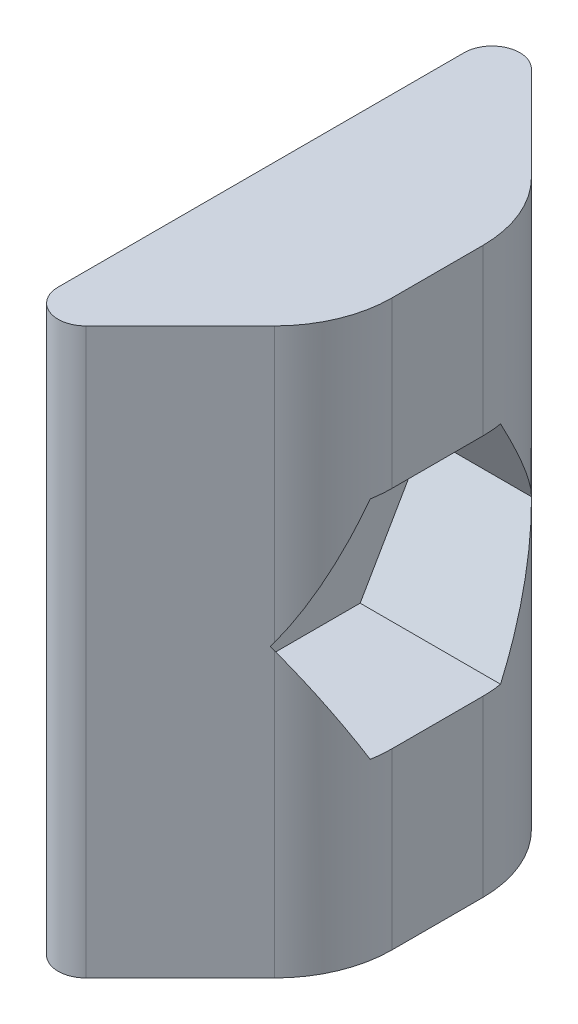
ISO-10303-21;
HEADER;
FILE_DESCRIPTION(('STEP AP214'),'2;1');
FILE_NAME('part.step','',(''),(''),'','','');
FILE_SCHEMA(('AUTOMOTIVE_DESIGN { 1 0 10303 214 1 1 1 1 }'));
ENDSEC;
DATA;
#1=APPLICATION_CONTEXT('core data for automotive mechanical design processes');
#2=APPLICATION_PROTOCOL_DEFINITION('international standard','automotive_design',2000,#1);
#3=PRODUCT_CONTEXT('',#1,'mechanical');
#4=PRODUCT('Part','Part','',(#3));
#5=PRODUCT_RELATED_PRODUCT_CATEGORY('part','',(#4));
#6=PRODUCT_DEFINITION_FORMATION('','',#4);
#7=PRODUCT_DEFINITION_CONTEXT('part definition',#1,'design');
#8=PRODUCT_DEFINITION('design','',#6,#7);
#9=PRODUCT_DEFINITION_SHAPE('','',#8);
#10=(LENGTH_UNIT() NAMED_UNIT(*) SI_UNIT(.MILLI.,.METRE.));
#11=(NAMED_UNIT(*) PLANE_ANGLE_UNIT() SI_UNIT($,.RADIAN.));
#12=(NAMED_UNIT(*) SI_UNIT($,.STERADIAN.) SOLID_ANGLE_UNIT());
#13=UNCERTAINTY_MEASURE_WITH_UNIT(LENGTH_MEASURE(1.E-05),#10,'distance_accuracy_value','');
#14=(GEOMETRIC_REPRESENTATION_CONTEXT(3) GLOBAL_UNCERTAINTY_ASSIGNED_CONTEXT((#13)) GLOBAL_UNIT_ASSIGNED_CONTEXT((#10,
#11,#12)) REPRESENTATION_CONTEXT('',''));
#15=CARTESIAN_POINT('',(0.,0.,0.));
#16=DIRECTION('',(0.,0.,1.));
#17=DIRECTION('',(1.,0.,0.));
#18=AXIS2_PLACEMENT_3D('',#15,#16,#17);
#19=CARTESIAN_POINT('',(634.903700866565,896.968143730619,1268.23178278987));
#20=DIRECTION('',(0.,-1.,0.));
#21=DIRECTION('',(1.,0.,0.));
#22=AXIS2_PLACEMENT_3D('',#19,#20,#21);
#23=CYLINDRICAL_SURFACE('',#22,2.91000000000477);
#24=CARTESIAN_POINT('',(634.903700866565,893.741114005556,1268.23178278987));
#25=DIRECTION('',(0.,0.499999999999795,0.866025403784557));
#26=DIRECTION('',(0.,-0.866025403784557,0.499999999999795));
#27=AXIS2_PLACEMENT_3D('',#24,#25,#26);
#28=ELLIPSE('',#27,5.82000000001192,2.91000000000477);
#29=CARTESIAN_POINT('',(636.961381599821,890.177106429798,1270.28946352312));
#30=VERTEX_POINT('',#29);
#31=CARTESIAN_POINT('',(637.770730822498,892.87814373062,1268.7300189104));
#32=VERTEX_POINT('',#31);
#33=EDGE_CURVE('E11',#30,#32,#28,.T.);
#34=ORIENTED_EDGE('',*,*,#33,.T.);
#35=CARTESIAN_POINT('',(634.903700866565,892.87814373062,1268.23178278987));
#36=DIRECTION('',(0.,1.,0.));
#37=DIRECTION('',(-1.,0.,0.));
#38=AXIS2_PLACEMENT_3D('',#35,#36,#37);
#39=CIRCLE('',#38,2.91000000000477);
#40=CARTESIAN_POINT('',(637.813700866569,892.87814373062,1268.23178278381));
#41=VERTEX_POINT('',#40);
#42=EDGE_CURVE('E247',#32,#41,#39,.T.);
#43=ORIENTED_EDGE('',*,*,#42,.T.);
#44=DIRECTION('',(0.,-1.,0.));
#45=VECTOR('',#44,1.);
#46=CARTESIAN_POINT('',(637.813700866569,896.968143730619,1268.23178278381));
#47=LINE('',#46,#45);
#48=CARTESIAN_POINT('',(637.813700866569,896.968143730619,1268.23178278381));
#49=VERTEX_POINT('',#48);
#50=EDGE_CURVE('E188',#49,#41,#47,.T.);
#51=ORIENTED_EDGE('',*,*,#50,.F.);
#52=CARTESIAN_POINT('',(634.903700866565,896.968143730619,1268.23178278987));
#53=DIRECTION('',(0.,1.,0.));
#54=DIRECTION('',(-1.,0.,0.));
#55=AXIS2_PLACEMENT_3D('',#52,#53,#54);
#56=CIRCLE('',#55,2.91000000000477);
#57=CARTESIAN_POINT('',(636.961381599821,896.968143730619,1270.28946352312));
#58=VERTEX_POINT('',#57);
#59=EDGE_CURVE('E259',#58,#49,#56,.T.);
#60=ORIENTED_EDGE('',*,*,#59,.F.);
#61=DIRECTION('',(0.,-1.,0.));
#62=VECTOR('',#61,1.);
#63=CARTESIAN_POINT('',(636.961381599821,896.968143730619,1270.28946352312));
#64=LINE('',#63,#62);
#65=EDGE_CURVE('E192',#58,#30,#64,.T.);
#66=ORIENTED_EDGE('',*,*,#65,.T.);
#67=EDGE_LOOP('',(#34,#43,#51,#60,#66));
#68=FACE_BOUND('',#67,.T.);
#69=ADVANCED_FACE('F39',(#68),#23,.T.);
#70=CARTESIAN_POINT('',(637.813700866569,896.968143730619,1268.23178278381));
#71=DIRECTION('',(-1.,0.,2.10070883581663E-09));
#72=DIRECTION('',(2.10070883581663E-09,0.,1.));
#73=AXIS2_PLACEMENT_3D('',#70,#71,#72);
#74=PLANE('',#73);
#75=DIRECTION('',(0.,-1.,0.));
#76=VECTOR('',#75,1.);
#77=CARTESIAN_POINT('',(637.813700861845,896.968143730619,1265.98264856524));
#78=LINE('',#77,#76);
#79=CARTESIAN_POINT('',(637.813700861845,887.288143730619,1265.98264857135));
#80=VERTEX_POINT('',#79);
#81=CARTESIAN_POINT('',(637.813700861845,882.968143730619,1265.98264856524));
#82=VERTEX_POINT('',#81);
#83=EDGE_CURVE('E183',#80,#82,#78,.T.);
#84=ORIENTED_EDGE('',*,*,#83,.F.);
#85=DIRECTION('',(2.10070883581663E-09,0.,1.));
#86=VECTOR('',#85,1.);
#87=CARTESIAN_POINT('',(637.813700866569,887.288143730619,1268.23178278381));
#88=LINE('',#87,#86);
#89=CARTESIAN_POINT('',(637.813700866569,887.288143730619,1268.23178278381));
#90=VERTEX_POINT('',#89);
#91=EDGE_CURVE('E244',#80,#90,#88,.T.);
#92=ORIENTED_EDGE('',*,*,#91,.T.);
#93=CARTESIAN_POINT('',(637.813700866569,882.968143730619,1268.23178278381));
#94=VERTEX_POINT('',#93);
#95=EDGE_CURVE('E187',#90,#94,#47,.T.);
#96=ORIENTED_EDGE('',*,*,#95,.T.);
#97=DIRECTION('',(-2.10070883581663E-09,0.,-1.));
#98=VECTOR('',#97,1.);
#99=CARTESIAN_POINT('',(637.813700866569,882.968143730619,1268.23178278381));
#100=LINE('',#99,#98);
#101=EDGE_CURVE('E157',#94,#82,#100,.T.);
#102=ORIENTED_EDGE('',*,*,#101,.T.);
#103=EDGE_LOOP('',(#84,#92,#96,#102));
#104=FACE_BOUND('',#103,.T.);
#105=ADVANCED_FACE('F242',(#104),#74,.F.);
#106=CARTESIAN_POINT('',(634.903700861859,896.968143730619,1265.98264857135));
#107=DIRECTION('',(0.,-1.,0.));
#108=DIRECTION('',(1.,0.,0.));
#109=AXIS2_PLACEMENT_3D('',#106,#107,#108);
#110=CYLINDRICAL_SURFACE('',#109,2.90999999998545);
#111=CARTESIAN_POINT('',(634.903700861859,886.45672874507,1265.98264857135));
#112=DIRECTION('',(0.,-0.499999999999773,-0.86602540378457));
#113=DIRECTION('',(0.,-0.86602540378457,0.499999999999773));
#114=AXIS2_PLACEMENT_3D('',#111,#112,#113);
#115=ELLIPSE('',#114,5.81999999997354,2.90999999998545);
#116=CARTESIAN_POINT('',(636.961381595102,890.020736320804,1263.92496783811));
#117=VERTEX_POINT('',#116);
#118=CARTESIAN_POINT('',(637.773837276826,887.288143730619,1265.50263090563));
#119=VERTEX_POINT('',#118);
#120=EDGE_CURVE('E342',#117,#119,#115,.T.);
#121=ORIENTED_EDGE('',*,*,#120,.T.);
#122=CARTESIAN_POINT('',(634.903700861859,887.288143730619,1265.98264857135));
#123=DIRECTION('',(0.,-1.,0.));
#124=DIRECTION('',(1.,0.,0.));
#125=AXIS2_PLACEMENT_3D('',#122,#123,#124);
#126=CIRCLE('',#125,2.90999999998545);
#127=EDGE_CURVE('E206',#119,#80,#126,.T.);
#128=ORIENTED_EDGE('',*,*,#127,.T.);
#129=ORIENTED_EDGE('',*,*,#83,.T.);
#130=CARTESIAN_POINT('',(634.903700861859,882.968143730619,1265.98264857135));
#131=DIRECTION('',(0.,1.,0.));
#132=DIRECTION('',(-1.,0.,0.));
#133=AXIS2_PLACEMENT_3D('',#130,#131,#132);
#134=CIRCLE('',#133,2.90999999998545);
#135=CARTESIAN_POINT('',(636.961381595102,882.968143730619,1263.92496783811));
#136=VERTEX_POINT('',#135);
#137=EDGE_CURVE('E160',#82,#136,#134,.T.);
#138=ORIENTED_EDGE('',*,*,#137,.T.);
#139=DIRECTION('',(0.,-1.,0.));
#140=VECTOR('',#139,1.);
#141=CARTESIAN_POINT('',(636.961381595102,896.968143730619,1263.92496783811));
#142=LINE('',#141,#140);
#143=EDGE_CURVE('E179',#117,#136,#142,.T.);
#144=ORIENTED_EDGE('',*,*,#143,.F.);
#145=EDGE_LOOP('',(#121,#128,#129,#138,#144));
#146=FACE_BOUND('',#145,.T.);
#147=ADVANCED_FACE('F347',(#146),#110,.T.);
#148=CARTESIAN_POINT('',(634.133700891333,896.968143730619,1272.14133687358));
#149=DIRECTION('',(0.,-1.,0.));
#150=DIRECTION('',(1.,0.,0.));
#151=AXIS2_PLACEMENT_3D('',#148,#149,#150);
#152=CYLINDRICAL_SURFACE('',#151,0.689999999997262);
#153=CARTESIAN_POINT('',(634.133700891333,882.968143730619,1272.14133687358));
#154=DIRECTION('',(0.,1.,0.));
#155=DIRECTION('',(-1.,0.,0.));
#156=AXIS2_PLACEMENT_3D('',#153,#154,#155);
#157=CIRCLE('',#156,0.689999999997262);
#158=CARTESIAN_POINT('',(633.443700891336,882.968143730619,1272.14133712409));
#159=VERTEX_POINT('',#158);
#160=CARTESIAN_POINT('',(634.62160457035,882.968143730619,1272.62924055259));
#161=VERTEX_POINT('',#160);
#162=EDGE_CURVE('E147',#159,#161,#157,.T.);
#163=ORIENTED_EDGE('',*,*,#162,.T.);
#164=DIRECTION('',(0.,-1.,0.));
#165=VECTOR('',#164,1.);
#166=CARTESIAN_POINT('',(634.62160457035,896.968143730619,1272.62924055259));
#167=LINE('',#166,#165);
#168=CARTESIAN_POINT('',(634.62160457035,896.968143730619,1272.62924055259));
#169=VERTEX_POINT('',#168);
#170=EDGE_CURVE('E195',#169,#161,#167,.T.);
#171=ORIENTED_EDGE('',*,*,#170,.F.);
#172=CARTESIAN_POINT('',(634.133700891333,896.968143730619,1272.14133687358));
#173=DIRECTION('',(0.,1.,0.));
#174=DIRECTION('',(-1.,0.,0.));
#175=AXIS2_PLACEMENT_3D('',#172,#173,#174);
#176=CIRCLE('',#175,0.689999999997262);
#177=CARTESIAN_POINT('',(633.443700891336,896.968143730619,1272.14133712409));
#178=VERTEX_POINT('',#177);
#179=EDGE_CURVE('E172',#178,#169,#176,.T.);
#180=ORIENTED_EDGE('',*,*,#179,.F.);
#181=DIRECTION('',(0.,-1.,0.));
#182=VECTOR('',#181,1.);
#183=CARTESIAN_POINT('',(633.443700891336,896.968143730619,1272.14133712409));
#184=LINE('',#183,#182);
#185=EDGE_CURVE('E143',#178,#159,#184,.T.);
#186=ORIENTED_EDGE('',*,*,#185,.T.);
#187=EDGE_LOOP('',(#163,#171,#180,#186));
#188=FACE_BOUND('',#187,.T.);
#189=ADVANCED_FACE('F41',(#188),#152,.T.);
#190=CARTESIAN_POINT('',(634.62160457035,896.968143730619,1272.62924055259));
#191=DIRECTION('',(-0.707106781186564,0.,-0.707106781186531));
#192=DIRECTION('',(-0.707106781186531,0.,0.707106781186564));
#193=AXIS2_PLACEMENT_3D('',#190,#191,#192);
#194=PLANE('',#193);
#195=DIRECTION('',(-0.447213595502763,0.774596669238232,0.447213595502784));
#196=VECTOR('',#195,1.);
#197=CARTESIAN_POINT('',(633.607887192195,895.797603728286,1273.64295793075));
#198=LINE('',#197,#196);
#199=CARTESIAN_POINT('',(636.961381599821,889.98918103144,1270.28946352312));
#200=VERTEX_POINT('',#199);
#201=CARTESIAN_POINT('',(636.907132210156,890.083143730619,1270.34371291279));
#202=VERTEX_POINT('',#201);
#203=EDGE_CURVE('E228',#200,#202,#198,.T.);
#204=ORIENTED_EDGE('',*,*,#203,.T.);
#205=DIRECTION('',(0.447213595499794,0.77459666924166,-0.447213595499815));
#206=VECTOR('',#205,1.);
#207=CARTESIAN_POINT('',(638.377955116257,892.630683732923,1268.87289000669));
#208=LINE('',#207,#206);
#209=EDGE_CURVE('E151',#202,#30,#208,.T.);
#210=ORIENTED_EDGE('',*,*,#209,.T.);
#211=ORIENTED_EDGE('',*,*,#65,.F.);
#212=DIRECTION('',(0.707106781186531,0.,-0.707106781186564));
#213=VECTOR('',#212,1.);
#214=CARTESIAN_POINT('',(634.62160457035,896.968143730619,1272.62924055259));
#215=LINE('',#214,#213);
#216=EDGE_CURVE('E111',#169,#58,#215,.T.);
#217=ORIENTED_EDGE('',*,*,#216,.F.);
#218=ORIENTED_EDGE('',*,*,#170,.T.);
#219=DIRECTION('',(0.707106781186531,0.,-0.707106781186564));
#220=VECTOR('',#219,1.);
#221=CARTESIAN_POINT('',(634.62160457035,882.968143730619,1272.62924055259));
#222=LINE('',#221,#220);
#223=CARTESIAN_POINT('',(636.961381599821,882.968143730619,1270.28946352312));
#224=VERTEX_POINT('',#223);
#225=EDGE_CURVE('E150',#161,#224,#222,.T.);
#226=ORIENTED_EDGE('',*,*,#225,.T.);
#227=EDGE_CURVE('E191',#200,#224,#64,.T.);
#228=ORIENTED_EDGE('',*,*,#227,.F.);
#229=EDGE_LOOP('',(#204,#210,#211,#217,#218,#226,#228));
#230=FACE_BOUND('',#229,.T.);
#231=ADVANCED_FACE('F226',(#230),#194,.F.);
#232=ORIENTED_EDGE('',*,*,#95,.F.);
#233=CARTESIAN_POINT('',(634.903700866565,887.288143730619,1268.23178278987));
#234=DIRECTION('',(0.,-1.,0.));
#235=DIRECTION('',(1.,0.,0.));
#236=AXIS2_PLACEMENT_3D('',#233,#234,#235);
#237=CIRCLE('',#236,2.91000000000477);
#238=CARTESIAN_POINT('',(637.7707308225,887.288143730619,1268.73001891041));
#239=VERTEX_POINT('',#238);
#240=EDGE_CURVE('E219',#90,#239,#237,.T.);
#241=ORIENTED_EDGE('',*,*,#240,.T.);
#242=CARTESIAN_POINT('',(634.903700866565,886.425173455722,1268.23178278987));
#243=DIRECTION('',(0.,-0.500000000003944,0.866025403782162));
#244=DIRECTION('',(0.,-0.866025403782162,-0.500000000003944));
#245=AXIS2_PLACEMENT_3D('',#242,#243,#244);
#246=ELLIPSE('',#245,5.81999999996363,2.91000000000477);
#247=EDGE_CURVE('E48',#239,#200,#246,.T.);
#248=ORIENTED_EDGE('',*,*,#247,.T.);
#249=ORIENTED_EDGE('',*,*,#227,.T.);
#250=CARTESIAN_POINT('',(634.903700866565,882.968143730619,1268.23178278987));
#251=DIRECTION('',(0.,1.,0.));
#252=DIRECTION('',(-1.,0.,0.));
#253=AXIS2_PLACEMENT_3D('',#250,#251,#252);
#254=CIRCLE('',#253,2.91000000000477);
#255=EDGE_CURVE('E154',#224,#94,#254,.T.);
#256=ORIENTED_EDGE('',*,*,#255,.T.);
#257=EDGE_LOOP('',(#232,#241,#248,#249,#256));
#258=FACE_BOUND('',#257,.T.);
#259=ADVANCED_FACE('F216',(#258),#23,.T.);
#260=ORIENTED_EDGE('',*,*,#50,.T.);
#261=DIRECTION('',(-2.10070883581663E-09,0.,-1.));
#262=VECTOR('',#261,1.);
#263=CARTESIAN_POINT('',(637.813700866569,892.87814373062,1268.23178278381));
#264=LINE('',#263,#262);
#265=CARTESIAN_POINT('',(637.813700861845,892.87814373062,1265.98264856524));
#266=VERTEX_POINT('',#265);
#267=EDGE_CURVE('E251',#41,#266,#264,.T.);
#268=ORIENTED_EDGE('',*,*,#267,.T.);
#269=CARTESIAN_POINT('',(637.813700861845,896.968143730619,1265.98264856524));
#270=VERTEX_POINT('',#269);
#271=EDGE_CURVE('E184',#270,#266,#78,.T.);
#272=ORIENTED_EDGE('',*,*,#271,.F.);
#273=DIRECTION('',(-2.10070883581663E-09,0.,-1.));
#274=VECTOR('',#273,1.);
#275=CARTESIAN_POINT('',(637.813700866569,896.968143730619,1268.23178278381));
#276=LINE('',#275,#274);
#277=EDGE_CURVE('E261',#49,#270,#276,.T.);
#278=ORIENTED_EDGE('',*,*,#277,.F.);
#279=EDGE_LOOP('',(#260,#268,#272,#278));
#280=FACE_BOUND('',#279,.T.);
#281=ADVANCED_FACE('F290',(#280),#74,.F.);
#282=CARTESIAN_POINT('',(634.903700861859,892.87814373062,1265.98264857135));
#283=DIRECTION('',(0.,1.,0.));
#284=DIRECTION('',(-1.,0.,0.));
#285=AXIS2_PLACEMENT_3D('',#282,#283,#284);
#286=CIRCLE('',#285,2.90999999998545);
#287=CARTESIAN_POINT('',(637.773837276827,892.87814373062,1265.50263090564));
#288=VERTEX_POINT('',#287);
#289=EDGE_CURVE('E203',#266,#288,#286,.T.);
#290=ORIENTED_EDGE('',*,*,#289,.T.);
#291=CARTESIAN_POINT('',(634.903700861859,893.709558716202,1265.98264857135));
#292=DIRECTION('',(0.,0.499999999996476,-0.866025403786473));
#293=DIRECTION('',(0.,-0.866025403786473,-0.499999999996476));
#294=AXIS2_PLACEMENT_3D('',#291,#292,#293);
#295=ELLIPSE('',#294,5.82000000001192,2.90999999998545);
#296=CARTESIAN_POINT('',(636.961381595102,890.145551140437,1263.92496783811));
#297=VERTEX_POINT('',#296);
#298=EDGE_CURVE('E298',#288,#297,#295,.T.);
#299=ORIENTED_EDGE('',*,*,#298,.T.);
#300=CARTESIAN_POINT('',(636.961381595102,896.968143730619,1263.92496783811));
#301=VERTEX_POINT('',#300);
#302=EDGE_CURVE('E180',#301,#297,#142,.T.);
#303=ORIENTED_EDGE('',*,*,#302,.F.);
#304=CARTESIAN_POINT('',(634.903700861859,896.968143730619,1265.98264857135));
#305=DIRECTION('',(0.,1.,0.));
#306=DIRECTION('',(-1.,0.,0.));
#307=AXIS2_PLACEMENT_3D('',#304,#305,#306);
#308=CIRCLE('',#307,2.90999999998545);
#309=EDGE_CURVE('E263',#270,#301,#308,.T.);
#310=ORIENTED_EDGE('',*,*,#309,.F.);
#311=ORIENTED_EDGE('',*,*,#271,.T.);
#312=EDGE_LOOP('',(#290,#299,#303,#310,#311));
#313=FACE_BOUND('',#312,.T.);
#314=ADVANCED_FACE('F294',(#313),#110,.T.);
#315=CARTESIAN_POINT('',(636.961381595102,896.968143730619,1263.92496783811));
#316=DIRECTION('',(-0.707106781186531,0.,0.707106781186564));
#317=DIRECTION('',(0.707106781186564,0.,0.707106781186531));
#318=AXIS2_PLACEMENT_3D('',#315,#316,#317);
#319=PLANE('',#318);
#320=DIRECTION('',(-0.447213595497453,-0.774596669244388,-0.447213595497432));
#321=VECTOR('',#320,1.);
#322=CARTESIAN_POINT('',(639.324796996205,894.239106694577,1266.28838323921));
#323=LINE('',#322,#321);
#324=CARTESIAN_POINT('',(636.925350660245,890.08314373062,1263.88893690325));
#325=VERTEX_POINT('',#324);
#326=EDGE_CURVE('E197',#297,#325,#323,.T.);
#327=ORIENTED_EDGE('',*,*,#326,.T.);
#328=DIRECTION('',(0.447213595499813,-0.774596669241663,0.447213595499791));
#329=VECTOR('',#328,1.);
#330=CARTESIAN_POINT('',(634.554729072166,894.189180766695,1261.51831531517));
#331=LINE('',#330,#329);
#332=EDGE_CURVE('E200',#325,#117,#331,.T.);
#333=ORIENTED_EDGE('',*,*,#332,.T.);
#334=ORIENTED_EDGE('',*,*,#143,.T.);
#335=DIRECTION('',(-0.707106781186564,0.,-0.707106781186531));
#336=VECTOR('',#335,1.);
#337=CARTESIAN_POINT('',(636.961381595102,882.968143730619,1263.92496783811));
#338=LINE('',#337,#336);
#339=CARTESIAN_POINT('',(634.621604564309,882.968143730619,1261.58519080731));
#340=VERTEX_POINT('',#339);
#341=EDGE_CURVE('E163',#136,#340,#338,.T.);
#342=ORIENTED_EDGE('',*,*,#341,.T.);
#343=DIRECTION('',(0.,-1.,0.));
#344=VECTOR('',#343,1.);
#345=CARTESIAN_POINT('',(634.621604564309,896.968143730619,1261.58519080731));
#346=LINE('',#345,#344);
#347=CARTESIAN_POINT('',(634.621604564309,896.968143730619,1261.58519080731));
#348=VERTEX_POINT('',#347);
#349=EDGE_CURVE('E176',#348,#340,#346,.T.);
#350=ORIENTED_EDGE('',*,*,#349,.F.);
#351=DIRECTION('',(-0.707106781186564,0.,-0.707106781186531));
#352=VECTOR('',#351,1.);
#353=CARTESIAN_POINT('',(636.961381595102,896.968143730619,1263.92496783811));
#354=LINE('',#353,#352);
#355=EDGE_CURVE('E265',#301,#348,#354,.T.);
#356=ORIENTED_EDGE('',*,*,#355,.F.);
#357=ORIENTED_EDGE('',*,*,#302,.T.);
#358=EDGE_LOOP('',(#327,#333,#334,#342,#350,#356,#357));
#359=FACE_BOUND('',#358,.T.);
#360=ADVANCED_FACE('F271',(#359),#319,.F.);
#361=CARTESIAN_POINT('',(634.13370088529,896.968143730619,1262.07309448633));
#362=DIRECTION('',(0.,-1.,0.));
#363=DIRECTION('',(1.,0.,0.));
#364=AXIS2_PLACEMENT_3D('',#361,#362,#363);
#365=CYLINDRICAL_SURFACE('',#364,0.689999999999811);
#366=CARTESIAN_POINT('',(634.13370088529,882.968143730619,1262.07309448633));
#367=DIRECTION('',(0.,1.,0.));
#368=DIRECTION('',(-1.,0.,0.));
#369=AXIS2_PLACEMENT_3D('',#366,#367,#368);
#370=CIRCLE('',#369,0.689999999999811);
#371=CARTESIAN_POINT('',(633.44370088529,882.968143730619,1262.07309423774));
#372=VERTEX_POINT('',#371);
#373=EDGE_CURVE('E165',#340,#372,#370,.T.);
#374=ORIENTED_EDGE('',*,*,#373,.T.);
#375=DIRECTION('',(0.,-1.,0.));
#376=VECTOR('',#375,1.);
#377=CARTESIAN_POINT('',(633.44370088529,896.968143730619,1262.07309423774));
#378=LINE('',#377,#376);
#379=CARTESIAN_POINT('',(633.44370088529,896.968143730619,1262.07309423774));
#380=VERTEX_POINT('',#379);
#381=EDGE_CURVE('E174',#380,#372,#378,.T.);
#382=ORIENTED_EDGE('',*,*,#381,.F.);
#383=CARTESIAN_POINT('',(634.13370088529,896.968143730619,1262.07309448633));
#384=DIRECTION('',(0.,1.,0.));
#385=DIRECTION('',(-1.,0.,0.));
#386=AXIS2_PLACEMENT_3D('',#383,#384,#385);
#387=CIRCLE('',#386,0.689999999999811);
#388=EDGE_CURVE('E137',#348,#380,#387,.T.);
#389=ORIENTED_EDGE('',*,*,#388,.F.);
#390=ORIENTED_EDGE('',*,*,#349,.T.);
#391=EDGE_LOOP('',(#374,#382,#389,#390));
#392=FACE_BOUND('',#391,.T.);
#393=ADVANCED_FACE('F275',(#392),#365,.T.);
#394=CARTESIAN_POINT('',(633.443700103782,896.968143730619,1269.97221554137));
#395=DIRECTION('',(0.999999999999934,0.,-3.63074991381097E-07));
#396=DIRECTION('',(-3.63074991381097E-07,0.,-0.999999999999934));
#397=AXIS2_PLACEMENT_3D('',#394,#395,#396);
#398=PLANE('',#397);
#399=CARTESIAN_POINT('',(633.44369906688,890.083143730619,1267.11632491623));
#400=DIRECTION('',(0.999999999999934,0.,-3.63074991381097E-07));
#401=DIRECTION('',(-3.63074991381097E-07,0.,-0.999999999999934));
#402=AXIS2_PLACEMENT_3D('',#399,#400,#401);
#403=CIRCLE('',#402,1.74999999999986);
#404=CARTESIAN_POINT('',(633.443698431499,890.083143730619,1265.36632491623));
#405=VERTEX_POINT('',#404);
#406=EDGE_CURVE('E383',#405,#405,#403,.T.);
#407=ORIENTED_EDGE('',*,*,#406,.T.);
#408=EDGE_LOOP('',(#407));
#409=FACE_BOUND('',#408,.T.);
#410=DIRECTION('',(3.63074991381097E-07,0.,0.999999999999934));
#411=VECTOR('',#410,1.);
#412=CARTESIAN_POINT('',(633.443700103782,882.968143730619,1269.97221554137));
#413=LINE('',#412,#411);
#414=CARTESIAN_POINT('',(633.443700103782,882.968143730619,1269.97221554137));
#415=VERTEX_POINT('',#414);
#416=EDGE_CURVE('E102',#415,#159,#413,.T.);
#417=ORIENTED_EDGE('',*,*,#416,.T.);
#418=ORIENTED_EDGE('',*,*,#185,.F.);
#419=DIRECTION('',(3.63074991381097E-07,0.,0.999999999999934));
#420=VECTOR('',#419,1.);
#421=CARTESIAN_POINT('',(633.443700103782,896.968143730619,1269.97221554137));
#422=LINE('',#421,#420);
#423=CARTESIAN_POINT('',(633.443700103782,896.968143730619,1269.97221554137));
#424=VERTEX_POINT('',#423);
#425=EDGE_CURVE('E64',#424,#178,#422,.T.);
#426=ORIENTED_EDGE('',*,*,#425,.F.);
#427=DIRECTION('',(6.58771111619776E-13,0.,1.));
#428=VECTOR('',#427,1.);
#429=CARTESIAN_POINT('',(633.443700103782,896.968143730619,1269.97221554137));
#430=LINE('',#429,#428);
#431=CARTESIAN_POINT('',(633.443700103779,896.968143730619,1264.24221582349));
#432=VERTEX_POINT('',#431);
#433=EDGE_CURVE('E135',#432,#424,#430,.T.);
#434=ORIENTED_EDGE('',*,*,#433,.F.);
#435=DIRECTION('',(-3.60289505825203E-07,0.,0.999999999999935));
#436=VECTOR('',#435,1.);
#437=CARTESIAN_POINT('',(633.44370088529,896.968143730619,1262.07309423774));
#438=LINE('',#437,#436);
#439=EDGE_CURVE('E132',#380,#432,#438,.T.);
#440=ORIENTED_EDGE('',*,*,#439,.F.);
#441=ORIENTED_EDGE('',*,*,#381,.T.);
#442=DIRECTION('',(-3.60289505825203E-07,0.,0.999999999999935));
#443=VECTOR('',#442,1.);
#444=CARTESIAN_POINT('',(633.44370088529,882.968143730619,1262.07309423774));
#445=LINE('',#444,#443);
#446=CARTESIAN_POINT('',(633.443700103779,882.968143730619,1264.24221582349));
#447=VERTEX_POINT('',#446);
#448=EDGE_CURVE('E167',#372,#447,#445,.T.);
#449=ORIENTED_EDGE('',*,*,#448,.T.);
#450=DIRECTION('',(6.58771111619776E-13,0.,1.));
#451=VECTOR('',#450,1.);
#452=CARTESIAN_POINT('',(633.443700103782,882.968143730619,1269.97221554137));
#453=LINE('',#452,#451);
#454=EDGE_CURVE('E169',#447,#415,#453,.T.);
#455=ORIENTED_EDGE('',*,*,#454,.T.);
#456=EDGE_LOOP('',(#417,#418,#426,#434,#440,#441,#449,#455));
#457=FACE_BOUND('',#456,.T.);
#458=ADVANCED_FACE('F141',(#409,#457),#398,.F.);
#459=CARTESIAN_POINT('',(634.133700891333,896.968143730619,1272.14133687358));
#460=DIRECTION('',(0.,1.,0.));
#461=DIRECTION('',(-1.,0.,0.));
#462=AXIS2_PLACEMENT_3D('',#459,#460,#461);
#463=PLANE('',#462);
#464=ORIENTED_EDGE('',*,*,#179,.T.);
#465=ORIENTED_EDGE('',*,*,#216,.T.);
#466=ORIENTED_EDGE('',*,*,#59,.T.);
#467=ORIENTED_EDGE('',*,*,#277,.T.);
#468=ORIENTED_EDGE('',*,*,#309,.T.);
#469=ORIENTED_EDGE('',*,*,#355,.T.);
#470=ORIENTED_EDGE('',*,*,#388,.T.);
#471=ORIENTED_EDGE('',*,*,#439,.T.);
#472=ORIENTED_EDGE('',*,*,#433,.T.);
#473=ORIENTED_EDGE('',*,*,#425,.T.);
#474=EDGE_LOOP('',(#464,#465,#466,#467,#468,#469,#470,#471,#472,#473));
#475=FACE_BOUND('',#474,.T.);
#476=ADVANCED_FACE('F134',(#475),#463,.T.);
#477=CARTESIAN_POINT('',(634.133700891333,882.968143730619,1272.14133687358));
#478=DIRECTION('',(0.,1.,0.));
#479=DIRECTION('',(-1.,0.,0.));
#480=AXIS2_PLACEMENT_3D('',#477,#478,#479);
#481=PLANE('',#480);
#482=ORIENTED_EDGE('',*,*,#162,.F.);
#483=ORIENTED_EDGE('',*,*,#416,.F.);
#484=ORIENTED_EDGE('',*,*,#454,.F.);
#485=ORIENTED_EDGE('',*,*,#448,.F.);
#486=ORIENTED_EDGE('',*,*,#373,.F.);
#487=ORIENTED_EDGE('',*,*,#341,.F.);
#488=ORIENTED_EDGE('',*,*,#137,.F.);
#489=ORIENTED_EDGE('',*,*,#101,.F.);
#490=ORIENTED_EDGE('',*,*,#255,.F.);
#491=ORIENTED_EDGE('',*,*,#225,.F.);
#492=EDGE_LOOP('',(#482,#483,#484,#485,#486,#487,#488,#489,#490,#491));
#493=FACE_BOUND('',#492,.T.);
#494=ADVANCED_FACE('F234',(#493),#481,.F.);
#495=CARTESIAN_POINT('',(644.293700103782,890.083143730619,1270.34371291279));
#496=DIRECTION('',(0.,0.499999999999795,0.866025403784557));
#497=DIRECTION('',(0.,-0.866025403784557,0.499999999999795));
#498=AXIS2_PLACEMENT_3D('',#495,#496,#497);
#499=PLANE('',#498);
#500=DIRECTION('',(-1.,0.,0.));
#501=VECTOR('',#500,1.);
#502=CARTESIAN_POINT('',(644.293700103782,890.083143730619,1270.34371291279));
#503=LINE('',#502,#501);
#504=CARTESIAN_POINT('',(634.293700103782,890.083143730619,1270.34371291279));
#505=VERTEX_POINT('',#504);
#506=EDGE_CURVE('E324',#202,#505,#503,.T.);
#507=ORIENTED_EDGE('',*,*,#506,.T.);
#508=DIRECTION('',(0.,0.866025403784557,-0.499999999999795));
#509=VECTOR('',#508,1.);
#510=CARTESIAN_POINT('',(634.293700103782,890.083143730619,1270.34371291279));
#511=LINE('',#510,#509);
#512=CARTESIAN_POINT('',(634.293700103782,892.87814373062,1268.7300189104));
#513=VERTEX_POINT('',#512);
#514=EDGE_CURVE('E376',#505,#513,#511,.T.);
#515=ORIENTED_EDGE('',*,*,#514,.T.);
#516=DIRECTION('',(-1.,0.,0.));
#517=VECTOR('',#516,1.);
#518=CARTESIAN_POINT('',(644.293700103782,892.87814373062,1268.7300189104));
#519=LINE('',#518,#517);
#520=EDGE_CURVE('E331',#32,#513,#519,.T.);
#521=ORIENTED_EDGE('',*,*,#520,.F.);
#522=ORIENTED_EDGE('',*,*,#33,.F.);
#523=ORIENTED_EDGE('',*,*,#209,.F.);
#524=EDGE_LOOP('',(#507,#515,#521,#522,#523));
#525=FACE_BOUND('',#524,.T.);
#526=ADVANCED_FACE('F321',(#525),#499,.F.);
#527=CARTESIAN_POINT('',(644.293700103782,887.401145100351,1268.79526028162));
#528=DIRECTION('',(0.,-0.500000000003944,0.866025403782162));
#529=DIRECTION('',(0.,-0.866025403782162,-0.500000000003944));
#530=AXIS2_PLACEMENT_3D('',#527,#528,#529);
#531=PLANE('',#530);
#532=ORIENTED_EDGE('',*,*,#247,.F.);
#533=DIRECTION('',(-1.,0.,0.));
#534=VECTOR('',#533,1.);
#535=CARTESIAN_POINT('',(644.293700103782,887.288143730619,1268.73001891041));
#536=LINE('',#535,#534);
#537=CARTESIAN_POINT('',(634.293700103782,887.288143730619,1268.73001891041));
#538=VERTEX_POINT('',#537);
#539=EDGE_CURVE('E332',#239,#538,#536,.T.);
#540=ORIENTED_EDGE('',*,*,#539,.T.);
#541=DIRECTION('',(0.,0.866025403782162,0.500000000003944));
#542=VECTOR('',#541,1.);
#543=CARTESIAN_POINT('',(634.293700103782,887.401145100351,1268.79526028162));
#544=LINE('',#543,#542);
#545=EDGE_CURVE('E330',#538,#505,#544,.T.);
#546=ORIENTED_EDGE('',*,*,#545,.T.);
#547=ORIENTED_EDGE('',*,*,#506,.F.);
#548=ORIENTED_EDGE('',*,*,#203,.F.);
#549=EDGE_LOOP('',(#532,#540,#546,#547,#548));
#550=FACE_BOUND('',#549,.T.);
#551=ADVANCED_FACE('F328',(#550),#531,.F.);
#552=CARTESIAN_POINT('',(644.293700103782,887.288143730619,1265.50263090563));
#553=DIRECTION('',(0.,-1.,0.));
#554=DIRECTION('',(1.,0.,0.));
#555=AXIS2_PLACEMENT_3D('',#552,#553,#554);
#556=PLANE('',#555);
#557=ORIENTED_EDGE('',*,*,#91,.F.);
#558=ORIENTED_EDGE('',*,*,#127,.F.);
#559=DIRECTION('',(-1.,0.,0.));
#560=VECTOR('',#559,1.);
#561=CARTESIAN_POINT('',(644.293700103782,887.288143730619,1265.50263090563));
#562=LINE('',#561,#560);
#563=CARTESIAN_POINT('',(634.293700103782,887.288143730619,1265.50263090563));
#564=VERTEX_POINT('',#563);
#565=EDGE_CURVE('E343',#119,#564,#562,.T.);
#566=ORIENTED_EDGE('',*,*,#565,.T.);
#567=DIRECTION('',(0.,0.,1.));
#568=VECTOR('',#567,1.);
#569=CARTESIAN_POINT('',(634.293700103782,887.288143730619,1265.50263090563));
#570=LINE('',#569,#568);
#571=EDGE_CURVE('E381',#564,#538,#570,.T.);
#572=ORIENTED_EDGE('',*,*,#571,.T.);
#573=ORIENTED_EDGE('',*,*,#539,.F.);
#574=ORIENTED_EDGE('',*,*,#240,.F.);
#575=EDGE_LOOP('',(#557,#558,#566,#572,#573,#574));
#576=FACE_BOUND('',#575,.T.);
#577=ADVANCED_FACE('F436',(#576),#556,.F.);
#578=CARTESIAN_POINT('',(644.293700103782,892.87814373062,1268.7300189104));
#579=DIRECTION('',(0.,1.,0.));
#580=DIRECTION('',(-1.,0.,0.));
#581=AXIS2_PLACEMENT_3D('',#578,#579,#580);
#582=PLANE('',#581);
#583=ORIENTED_EDGE('',*,*,#520,.T.);
#584=DIRECTION('',(0.,0.,-1.));
#585=VECTOR('',#584,1.);
#586=CARTESIAN_POINT('',(634.293700103782,892.87814373062,1268.7300189104));
#587=LINE('',#586,#585);
#588=CARTESIAN_POINT('',(634.293700103782,892.87814373062,1265.50263090564));
#589=VERTEX_POINT('',#588);
#590=EDGE_CURVE('E374',#513,#589,#587,.T.);
#591=ORIENTED_EDGE('',*,*,#590,.T.);
#592=DIRECTION('',(-1.,0.,0.));
#593=VECTOR('',#592,1.);
#594=CARTESIAN_POINT('',(644.293700103782,892.87814373062,1265.50263090564));
#595=LINE('',#594,#593);
#596=EDGE_CURVE('E335',#288,#589,#595,.T.);
#597=ORIENTED_EDGE('',*,*,#596,.F.);
#598=ORIENTED_EDGE('',*,*,#289,.F.);
#599=ORIENTED_EDGE('',*,*,#267,.F.);
#600=ORIENTED_EDGE('',*,*,#42,.F.);
#601=EDGE_LOOP('',(#583,#591,#597,#598,#599,#600));
#602=FACE_BOUND('',#601,.T.);
#603=ADVANCED_FACE('F375',(#602),#582,.F.);
#604=CARTESIAN_POINT('',(644.293700103782,890.08314373062,1263.88893690325));
#605=DIRECTION('',(0.,-0.499999999999773,-0.86602540378457));
#606=DIRECTION('',(0.,0.86602540378457,-0.499999999999773));
#607=AXIS2_PLACEMENT_3D('',#604,#605,#606);
#608=PLANE('',#607);
#609=ORIENTED_EDGE('',*,*,#332,.F.);
#610=DIRECTION('',(-1.,0.,0.));
#611=VECTOR('',#610,1.);
#612=CARTESIAN_POINT('',(644.293700103782,890.08314373062,1263.88893690325));
#613=LINE('',#612,#611);
#614=CARTESIAN_POINT('',(634.293700103782,890.08314373062,1263.88893690325));
#615=VERTEX_POINT('',#614);
#616=EDGE_CURVE('E55',#325,#615,#613,.T.);
#617=ORIENTED_EDGE('',*,*,#616,.T.);
#618=DIRECTION('',(0.,-0.866025403784569,0.499999999999773));
#619=VECTOR('',#618,1.);
#620=CARTESIAN_POINT('',(634.293700103782,890.08314373062,1263.88893690325));
#621=LINE('',#620,#619);
#622=EDGE_CURVE('E337',#615,#564,#621,.T.);
#623=ORIENTED_EDGE('',*,*,#622,.T.);
#624=ORIENTED_EDGE('',*,*,#565,.F.);
#625=ORIENTED_EDGE('',*,*,#120,.F.);
#626=EDGE_LOOP('',(#609,#617,#623,#624,#625));
#627=FACE_BOUND('',#626,.T.);
#628=ADVANCED_FACE('F350',(#627),#608,.F.);
#629=CARTESIAN_POINT('',(644.293700103782,892.765142360909,1265.4373895344));
#630=DIRECTION('',(0.,0.499999999996476,-0.866025403786473));
#631=DIRECTION('',(0.,0.866025403786473,0.499999999996476));
#632=AXIS2_PLACEMENT_3D('',#629,#630,#631);
#633=PLANE('',#632);
#634=ORIENTED_EDGE('',*,*,#596,.T.);
#635=DIRECTION('',(0.,-0.866025403786473,-0.499999999996476));
#636=VECTOR('',#635,1.);
#637=CARTESIAN_POINT('',(634.293700103782,892.765142360909,1265.4373895344));
#638=LINE('',#637,#636);
#639=EDGE_CURVE('E366',#589,#615,#638,.T.);
#640=ORIENTED_EDGE('',*,*,#639,.T.);
#641=ORIENTED_EDGE('',*,*,#616,.F.);
#642=ORIENTED_EDGE('',*,*,#326,.F.);
#643=ORIENTED_EDGE('',*,*,#298,.F.);
#644=EDGE_LOOP('',(#634,#640,#641,#642,#643));
#645=FACE_BOUND('',#644,.T.);
#646=ADVANCED_FACE('F364',(#645),#633,.F.);
#647=CARTESIAN_POINT('',(634.293700103782,0.,0.));
#648=DIRECTION('',(-1.,0.,0.));
#649=DIRECTION('',(0.,0.,1.));
#650=AXIS2_PLACEMENT_3D('',#647,#648,#649);
#651=PLANE('',#650);
#652=CARTESIAN_POINT('',(634.293700103782,890.083143730619,1267.11632491623));
#653=DIRECTION('',(-1.,0.,0.));
#654=DIRECTION('',(0.,0.,1.));
#655=AXIS2_PLACEMENT_3D('',#652,#653,#654);
#656=CIRCLE('',#655,1.74999999999986);
#657=CARTESIAN_POINT('',(634.293700103782,890.083143730619,1268.86632491623));
#658=VERTEX_POINT('',#657);
#659=EDGE_CURVE('E43',#658,#658,#656,.T.);
#660=ORIENTED_EDGE('',*,*,#659,.T.);
#661=EDGE_LOOP('',(#660));
#662=FACE_BOUND('',#661,.T.);
#663=ORIENTED_EDGE('',*,*,#571,.F.);
#664=ORIENTED_EDGE('',*,*,#622,.F.);
#665=ORIENTED_EDGE('',*,*,#639,.F.);
#666=ORIENTED_EDGE('',*,*,#590,.F.);
#667=ORIENTED_EDGE('',*,*,#514,.F.);
#668=ORIENTED_EDGE('',*,*,#545,.F.);
#669=EDGE_LOOP('',(#663,#664,#665,#666,#667,#668));
#670=FACE_BOUND('',#669,.T.);
#671=ADVANCED_FACE('F373',(#662,#670),#651,.F.);
#672=CARTESIAN_POINT('',(638.493700103782,890.083143730619,1267.11632491623));
#673=DIRECTION('',(-1.,0.,0.));
#674=DIRECTION('',(0.,-1.,0.));
#675=AXIS2_PLACEMENT_3D('',#672,#673,#674);
#676=CYLINDRICAL_SURFACE('',#675,1.74999999999986);
#677=ORIENTED_EDGE('',*,*,#659,.F.);
#678=EDGE_LOOP('',(#677));
#679=FACE_BOUND('',#678,.T.);
#680=ORIENTED_EDGE('',*,*,#406,.F.);
#681=EDGE_LOOP('',(#680));
#682=FACE_BOUND('',#681,.T.);
#683=ADVANCED_FACE('F391',(#679,#682),#676,.F.);
#684=CLOSED_SHELL('',(#69,#105,#147,#189,#231,#259,#281,#314,#360,#393,#458,#476,#494,#526,#551,
#577,#603,#628,#646,#671,#683));
#685=MANIFOLD_SOLID_BREP('B2',#684);
#686=ADVANCED_BREP_SHAPE_REPRESENTATION('',(#18,#685),#14);
#687=SHAPE_DEFINITION_REPRESENTATION(#9,#686);
ENDSEC;
END-ISO-10303-21;
